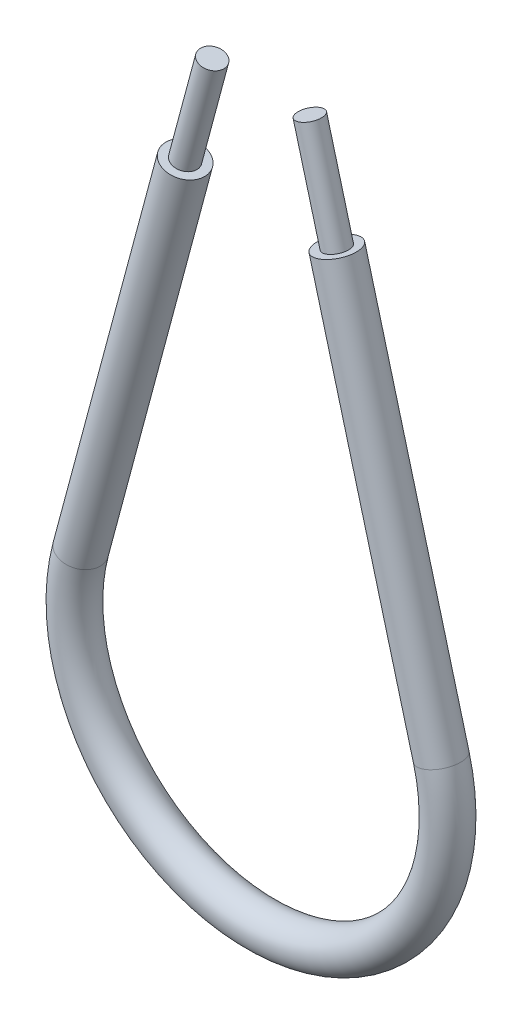
ISO-10303-21;
HEADER;
FILE_DESCRIPTION(('STEP AP214'),'2;1');
FILE_NAME('part.step','',(''),(''),'','','');
FILE_SCHEMA(('AUTOMOTIVE_DESIGN { 1 0 10303 214 1 1 1 1 }'));
ENDSEC;
DATA;
#1=APPLICATION_CONTEXT('core data for automotive mechanical design processes');
#2=APPLICATION_PROTOCOL_DEFINITION('international standard','automotive_design',2000,#1);
#3=PRODUCT_CONTEXT('',#1,'mechanical');
#4=PRODUCT('Part','Part','',(#3));
#5=PRODUCT_RELATED_PRODUCT_CATEGORY('part','',(#4));
#6=PRODUCT_DEFINITION_FORMATION('','',#4);
#7=PRODUCT_DEFINITION_CONTEXT('part definition',#1,'design');
#8=PRODUCT_DEFINITION('design','',#6,#7);
#9=PRODUCT_DEFINITION_SHAPE('','',#8);
#10=(LENGTH_UNIT() NAMED_UNIT(*) SI_UNIT(.MILLI.,.METRE.));
#11=(NAMED_UNIT(*) PLANE_ANGLE_UNIT() SI_UNIT($,.RADIAN.));
#12=(NAMED_UNIT(*) SI_UNIT($,.STERADIAN.) SOLID_ANGLE_UNIT());
#13=UNCERTAINTY_MEASURE_WITH_UNIT(LENGTH_MEASURE(1.E-05),#10,'distance_accuracy_value','');
#14=(GEOMETRIC_REPRESENTATION_CONTEXT(3) GLOBAL_UNCERTAINTY_ASSIGNED_CONTEXT((#13)) GLOBAL_UNIT_ASSIGNED_CONTEXT((#10,
#11,#12)) REPRESENTATION_CONTEXT('',''));
#15=CARTESIAN_POINT('',(0.,0.,0.));
#16=DIRECTION('',(0.,0.,1.));
#17=DIRECTION('',(1.,0.,0.));
#18=AXIS2_PLACEMENT_3D('',#15,#16,#17);
#19=CARTESIAN_POINT('',(-138.985158779205,-15.4299175134411,-2.4980018054066E-13));
#20=DIRECTION('',(-0.258819045102517,-0.965925826289075,0.));
#21=DIRECTION('',(0.965925826289063,-0.258819045102519,0.));
#22=AXIS2_PLACEMENT_3D('',#19,#20,#21);
#23=CYLINDRICAL_SURFACE('',#22,3.96875000000001);
#24=CARTESIAN_POINT('',(-159.61895517711,-92.4362940234599,0.));
#25=DIRECTION('',(0.258819045102516,0.965925826289075,0.));
#26=DIRECTION('',(-0.965925826289063,0.258819045102517,0.));
#27=AXIS2_PLACEMENT_3D('',#24,#25,#26);
#28=CIRCLE('',#27,3.96875000000001);
#29=CARTESIAN_POINT('',(-163.452473300195,-91.4091059382091,0.));
#30=VERTEX_POINT('',#29);
#31=EDGE_CURVE('E110',#30,#30,#28,.T.);
#32=ORIENTED_EDGE('',*,*,#31,.T.);
#33=EDGE_LOOP('',(#32));
#34=FACE_BOUND('',#33,.T.);
#35=CARTESIAN_POINT('',(-138.985158779205,-15.4299175134411,-2.4980018054066E-13));
#36=DIRECTION('',(0.258819045102516,0.965925826289075,0.));
#37=DIRECTION('',(-0.965925826289063,0.258819045102517,0.));
#38=AXIS2_PLACEMENT_3D('',#35,#36,#37);
#39=CIRCLE('',#38,3.96875000000001);
#40=CARTESIAN_POINT('',(-142.818676902289,-14.4027294281905,-1.2490009027033E-12));
#41=VERTEX_POINT('',#40);
#42=EDGE_CURVE('E59',#41,#41,#39,.T.);
#43=ORIENTED_EDGE('',*,*,#42,.F.);
#44=EDGE_LOOP('',(#43));
#45=FACE_BOUND('',#44,.T.);
#46=ADVANCED_FACE('F44',(#34,#45),#23,.T.);
#47=CARTESIAN_POINT('',(-124.004465969192,-101.979167645568,-1.22124532708767E-12));
#48=DIRECTION('',(0.,0.,1.));
#49=DIRECTION('',(1.,0.,0.));
#50=AXIS2_PLACEMENT_3D('',#47,#48,#49);
#51=TOROIDAL_SURFACE('',#50,36.8708323544294,3.96875000000001);
#52=CARTESIAN_POINT('',(-88.3899767612737,-92.4362940234591,-3.33066907387547E-13));
#53=DIRECTION('',(0.258819045102515,-0.96592582628907,0.));
#54=DIRECTION('',(0.965925826289076,0.258819045102515,0.));
#55=AXIS2_PLACEMENT_3D('',#52,#53,#54);
#56=CIRCLE('',#55,3.96875000000001);
#57=CARTESIAN_POINT('',(-84.5564586381897,-91.4091059382086,-2.37464018109115E-13));
#58=VERTEX_POINT('',#57);
#59=EDGE_CURVE('E48',#58,#58,#56,.T.);
#60=CARTESIAN_POINT('',(-124.004465969192,-101.979167645568,-1.22124532708767E-12));
#61=DIRECTION('',(0.,0.,1.));
#62=DIRECTION('',(1.,0.,0.));
#63=AXIS2_PLACEMENT_3D('',#60,#61,#62);
#64=CIRCLE('',#63,40.8395823544294);
#65=EDGE_CURVE('',#30,#58,#64,.T.);
#66=ORIENTED_EDGE('',*,*,#31,.F.);
#67=ORIENTED_EDGE('',*,*,#59,.T.);
#68=ORIENTED_EDGE('',*,*,#65,.T.);
#69=ORIENTED_EDGE('',*,*,#65,.F.);
#70=EDGE_LOOP('',(#66,#68,#67,#69));
#71=FACE_BOUND('',#70,.T.);
#72=ADVANCED_FACE('F117',(#71),#51,.T.);
#73=CARTESIAN_POINT('',(-88.3899767612737,-92.4362940234591,-3.33066907387547E-13));
#74=DIRECTION('',(-0.258819045102514,0.965925826289069,0.));
#75=DIRECTION('',(-0.965925826289076,-0.258819045102514,0.));
#76=AXIS2_PLACEMENT_3D('',#73,#74,#75);
#77=CYLINDRICAL_SURFACE('',#76,3.96875000000001);
#78=CARTESIAN_POINT('',(-109.02377315918,-15.4299175134413,-1.22124532708767E-12));
#79=DIRECTION('',(0.258819045102515,-0.96592582628907,0.));
#80=DIRECTION('',(0.965925826289076,0.258819045102515,0.));
#81=AXIS2_PLACEMENT_3D('',#78,#79,#80);
#82=CIRCLE('',#81,3.96875000000001);
#83=CARTESIAN_POINT('',(-105.190255036096,-14.4027294281898,-1.02695629777827E-12));
#84=VERTEX_POINT('',#83);
#85=EDGE_CURVE('E64',#84,#84,#82,.T.);
#86=ORIENTED_EDGE('',*,*,#85,.T.);
#87=EDGE_LOOP('',(#86));
#88=FACE_BOUND('',#87,.T.);
#89=ORIENTED_EDGE('',*,*,#59,.F.);
#90=EDGE_LOOP('',(#89));
#91=FACE_BOUND('',#90,.T.);
#92=ADVANCED_FACE('F46',(#88,#91),#77,.T.);
#93=CARTESIAN_POINT('',(-138.985158779205,-15.4299175134411,-2.4980018054066E-13));
#94=DIRECTION('',(0.258819045102516,0.965925826289075,0.));
#95=DIRECTION('',(-0.965925826289063,0.258819045102517,0.));
#96=AXIS2_PLACEMENT_3D('',#93,#94,#95);
#97=PLANE('',#96);
#98=CARTESIAN_POINT('',(-138.985158779205,-15.4299175134411,-2.4980018054066E-13));
#99=DIRECTION('',(0.258819045102516,0.965925826289075,0.));
#100=DIRECTION('',(-0.965925826289063,0.258819045102517,0.));
#101=AXIS2_PLACEMENT_3D('',#98,#99,#100);
#102=CIRCLE('',#101,2.38125);
#103=CARTESIAN_POINT('',(-141.285269653055,-14.8136046622911,-1.19348975147204E-12));
#104=VERTEX_POINT('',#103);
#105=EDGE_CURVE('E103',#104,#104,#102,.F.);
#106=ORIENTED_EDGE('',*,*,#105,.T.);
#107=EDGE_LOOP('',(#106));
#108=FACE_BOUND('',#107,.T.);
#109=ORIENTED_EDGE('',*,*,#42,.T.);
#110=EDGE_LOOP('',(#109));
#111=FACE_BOUND('',#110,.T.);
#112=ADVANCED_FACE('F77',(#108,#111),#97,.T.);
#113=CARTESIAN_POINT('',(-109.02377315918,-15.4299175134413,-1.22124532708767E-12));
#114=DIRECTION('',(0.258819045102515,-0.96592582628907,0.));
#115=DIRECTION('',(0.965925826289076,0.258819045102515,0.));
#116=AXIS2_PLACEMENT_3D('',#113,#114,#115);
#117=PLANE('',#116);
#118=CARTESIAN_POINT('',(-109.02377315918,-15.4299175134413,-1.22124532708767E-12));
#119=DIRECTION('',(0.258819045102515,-0.96592582628907,0.));
#120=DIRECTION('',(0.965925826289076,0.258819045102515,0.));
#121=AXIS2_PLACEMENT_3D('',#118,#119,#120);
#122=CIRCLE('',#121,2.38125);
#123=CARTESIAN_POINT('',(-106.723662285329,-14.8136046622901,-1.0547118733939E-12));
#124=VERTEX_POINT('',#123);
#125=EDGE_CURVE('E12',#124,#124,#122,.F.);
#126=ORIENTED_EDGE('',*,*,#125,.F.);
#127=EDGE_LOOP('',(#126));
#128=FACE_BOUND('',#127,.T.);
#129=ORIENTED_EDGE('',*,*,#85,.F.);
#130=EDGE_LOOP('',(#129));
#131=FACE_BOUND('',#130,.T.);
#132=ADVANCED_FACE('F74',(#128,#131),#117,.F.);
#133=CARTESIAN_POINT('',(-138.985158779205,-15.4299175134411,-2.4980018054066E-13));
#134=DIRECTION('',(-0.258819045102517,-0.965925826289075,0.));
#135=DIRECTION('',(0.965925826289063,-0.258819045102519,0.));
#136=AXIS2_PLACEMENT_3D('',#133,#134,#135);
#137=CYLINDRICAL_SURFACE('',#136,2.38125);
#138=CARTESIAN_POINT('',(-159.61895517711,-92.4362940234599,0.));
#139=DIRECTION('',(0.258819045102516,0.965925826289075,0.));
#140=DIRECTION('',(-0.965925826289063,0.258819045102517,0.));
#141=AXIS2_PLACEMENT_3D('',#138,#139,#140);
#142=CIRCLE('',#141,2.38125);
#143=CARTESIAN_POINT('',(-161.919066050961,-91.8199811723094,0.));
#144=VERTEX_POINT('',#143);
#145=EDGE_CURVE('E102',#144,#144,#142,.F.);
#146=ORIENTED_EDGE('',*,*,#145,.T.);
#147=EDGE_LOOP('',(#146));
#148=FACE_BOUND('',#147,.T.);
#149=ORIENTED_EDGE('',*,*,#105,.F.);
#150=EDGE_LOOP('',(#149));
#151=FACE_BOUND('',#150,.T.);
#152=ADVANCED_FACE('F76',(#148,#151),#137,.F.);
#153=CARTESIAN_POINT('',(-124.004465969192,-101.979167645568,-1.22124532708767E-12));
#154=DIRECTION('',(0.,0.,1.));
#155=DIRECTION('',(1.,0.,0.));
#156=AXIS2_PLACEMENT_3D('',#153,#154,#155);
#157=TOROIDAL_SURFACE('',#156,36.8708323544294,2.38125);
#158=CARTESIAN_POINT('',(-88.3899767612737,-92.4362940234591,-3.33066907387547E-13));
#159=DIRECTION('',(0.258819045102515,-0.96592582628907,0.));
#160=DIRECTION('',(0.965925826289076,0.258819045102515,0.));
#161=AXIS2_PLACEMENT_3D('',#158,#159,#160);
#162=CIRCLE('',#161,2.38125);
#163=CARTESIAN_POINT('',(-86.0898658874236,-91.8199811723089,-2.75705173820495E-13));
#164=VERTEX_POINT('',#163);
#165=EDGE_CURVE('E53',#164,#164,#162,.F.);
#166=CARTESIAN_POINT('',(-124.004465969192,-101.979167645568,-1.22124532708767E-12));
#167=DIRECTION('',(0.,0.,1.));
#168=DIRECTION('',(1.,0.,0.));
#169=AXIS2_PLACEMENT_3D('',#166,#167,#168);
#170=CIRCLE('',#169,39.2520823544294);
#171=EDGE_CURVE('',#144,#164,#170,.T.);
#172=ORIENTED_EDGE('',*,*,#145,.F.);
#173=ORIENTED_EDGE('',*,*,#165,.T.);
#174=ORIENTED_EDGE('',*,*,#171,.T.);
#175=ORIENTED_EDGE('',*,*,#171,.F.);
#176=EDGE_LOOP('',(#172,#174,#173,#175));
#177=FACE_BOUND('',#176,.T.);
#178=ADVANCED_FACE('F83',(#177),#157,.F.);
#179=CARTESIAN_POINT('',(-88.3899767612737,-92.4362940234591,-3.33066907387547E-13));
#180=DIRECTION('',(-0.258819045102514,0.965925826289069,0.));
#181=DIRECTION('',(-0.965925826289076,-0.258819045102514,0.));
#182=AXIS2_PLACEMENT_3D('',#179,#180,#181);
#183=CYLINDRICAL_SURFACE('',#182,2.38125);
#184=ORIENTED_EDGE('',*,*,#125,.T.);
#185=EDGE_LOOP('',(#184));
#186=FACE_BOUND('',#185,.T.);
#187=ORIENTED_EDGE('',*,*,#165,.F.);
#188=EDGE_LOOP('',(#187));
#189=FACE_BOUND('',#188,.T.);
#190=ADVANCED_FACE('F71',(#186,#189),#183,.F.);
#191=CLOSED_SHELL('',(#46,#72,#92,#112,#132,#152,#178,#190));
#192=MANIFOLD_SOLID_BREP('B2',#191);
#193=CARTESIAN_POINT('',(-114.365151202483,4.50437672659953,0.));
#194=DIRECTION('',(0.258819045102515,-0.96592582628907,0.));
#195=DIRECTION('',(0.965925826289075,0.258819045102515,0.));
#196=AXIS2_PLACEMENT_3D('',#193,#194,#195);
#197=PLANE('',#196);
#198=CARTESIAN_POINT('',(-114.365151202483,4.50437672659953,0.));
#199=DIRECTION('',(0.258819045102515,-0.96592582628907,0.));
#200=DIRECTION('',(0.965925826289075,0.258819045102515,0.));
#201=AXIS2_PLACEMENT_3D('',#198,#199,#200);
#202=CIRCLE('',#201,2.38125);
#203=CARTESIAN_POINT('',(-112.065040328633,5.12068957774967,-1.2490009027033E-12));
#204=VERTEX_POINT('',#203);
#205=EDGE_CURVE('E183',#204,#204,#202,.T.);
#206=ORIENTED_EDGE('',*,*,#205,.F.);
#207=EDGE_LOOP('',(#206));
#208=FACE_BOUND('',#207,.T.);
#209=ADVANCED_FACE('F171',(#208),#197,.F.);
#210=CARTESIAN_POINT('',(-133.643780735901,4.50437672660017,-5.82867087928207E-13));
#211=DIRECTION('',(0.258819045102514,0.965925826289076,0.));
#212=DIRECTION('',(-0.965925826289064,0.258819045102513,0.));
#213=AXIS2_PLACEMENT_3D('',#210,#211,#212);
#214=PLANE('',#213);
#215=CARTESIAN_POINT('',(-133.643780735901,4.50437672660017,-5.82867087928207E-13));
#216=DIRECTION('',(0.258819045102514,0.965925826289076,0.));
#217=DIRECTION('',(-0.965925826289064,0.258819045102513,0.));
#218=AXIS2_PLACEMENT_3D('',#215,#216,#217);
#219=CIRCLE('',#218,2.38125);
#220=CARTESIAN_POINT('',(-135.943891609752,5.12068957774947,-9.99200722162641E-13));
#221=VERTEX_POINT('',#220);
#222=EDGE_CURVE('E42',#221,#221,#219,.T.);
#223=ORIENTED_EDGE('',*,*,#222,.T.);
#224=EDGE_LOOP('',(#223));
#225=FACE_BOUND('',#224,.T.);
#226=ADVANCED_FACE('F186',(#225),#214,.T.);
#227=CARTESIAN_POINT('',(-114.365151202483,4.50437672659953,0.));
#228=DIRECTION('',(0.258819045102514,-0.965925826289069,0.));
#229=DIRECTION('',(0.965925826289076,0.258819045102514,0.));
#230=AXIS2_PLACEMENT_3D('',#227,#228,#229);
#231=CYLINDRICAL_SURFACE('',#230,2.38125);
#232=CARTESIAN_POINT('',(-88.3899767612737,-92.436294023459,-5.55111512312578E-13));
#233=DIRECTION('',(0.258819045102515,-0.96592582628907,0.));
#234=DIRECTION('',(0.965925826289075,0.258819045102515,0.));
#235=AXIS2_PLACEMENT_3D('',#232,#233,#234);
#236=CIRCLE('',#235,2.38125);
#237=CARTESIAN_POINT('',(-86.0898658874237,-91.8199811723088,-5.13882766311262E-13));
#238=VERTEX_POINT('',#237);
#239=EDGE_CURVE('E196',#238,#238,#236,.T.);
#240=ORIENTED_EDGE('',*,*,#239,.F.);
#241=EDGE_LOOP('',(#240));
#242=FACE_BOUND('',#241,.T.);
#243=ORIENTED_EDGE('',*,*,#205,.T.);
#244=EDGE_LOOP('',(#243));
#245=FACE_BOUND('',#244,.T.);
#246=ADVANCED_FACE('F201',(#242,#245),#231,.T.);
#247=CARTESIAN_POINT('',(-124.004465969192,-101.979167645568,-1.19348975147204E-12));
#248=DIRECTION('',(0.,0.,-1.));
#249=DIRECTION('',(-1.,0.,0.));
#250=AXIS2_PLACEMENT_3D('',#247,#248,#249);
#251=TOROIDAL_SURFACE('',#250,36.8708323544294,2.38125);
#252=CARTESIAN_POINT('',(-159.61895517711,-92.4362940234597,-1.11022302462516E-13));
#253=DIRECTION('',(0.258819045102515,0.965925826289076,0.));
#254=DIRECTION('',(-0.965925826289065,0.258819045102515,0.));
#255=AXIS2_PLACEMENT_3D('',#252,#253,#254);
#256=CIRCLE('',#255,2.38125);
#257=CARTESIAN_POINT('',(-161.919066050961,-91.8199811723092,0.));
#258=VERTEX_POINT('',#257);
#259=EDGE_CURVE('E178',#258,#258,#256,.T.);
#260=CARTESIAN_POINT('',(-124.004465969192,-101.979167645568,-1.19348975147204E-12));
#261=DIRECTION('',(0.,0.,-1.));
#262=DIRECTION('',(-1.,0.,0.));
#263=AXIS2_PLACEMENT_3D('',#260,#261,#262);
#264=CIRCLE('',#263,39.2520823544294);
#265=EDGE_CURVE('',#238,#258,#264,.T.);
#266=ORIENTED_EDGE('',*,*,#239,.T.);
#267=ORIENTED_EDGE('',*,*,#259,.F.);
#268=ORIENTED_EDGE('',*,*,#265,.T.);
#269=ORIENTED_EDGE('',*,*,#265,.F.);
#270=EDGE_LOOP('',(#266,#268,#267,#269));
#271=FACE_BOUND('',#270,.T.);
#272=ADVANCED_FACE('F191',(#271),#251,.T.);
#273=CARTESIAN_POINT('',(-159.61895517711,-92.4362940234601,0.));
#274=DIRECTION('',(0.258819045102514,0.965925826289076,0.));
#275=DIRECTION('',(-0.965925826289064,0.258819045102514,0.));
#276=AXIS2_PLACEMENT_3D('',#273,#274,#275);
#277=CYLINDRICAL_SURFACE('',#276,2.38125);
#278=ORIENTED_EDGE('',*,*,#222,.F.);
#279=EDGE_LOOP('',(#278));
#280=FACE_BOUND('',#279,.T.);
#281=ORIENTED_EDGE('',*,*,#259,.T.);
#282=EDGE_LOOP('',(#281));
#283=FACE_BOUND('',#282,.T.);
#284=ADVANCED_FACE('F188',(#280,#283),#277,.T.);
#285=CLOSED_SHELL('',(#209,#226,#246,#272,#284));
#286=MANIFOLD_SOLID_BREP('B6',#285);
#287=ADVANCED_BREP_SHAPE_REPRESENTATION('',(#18,#192,#286),#14);
#288=SHAPE_DEFINITION_REPRESENTATION(#9,#287);
ENDSEC;
END-ISO-10303-21;
